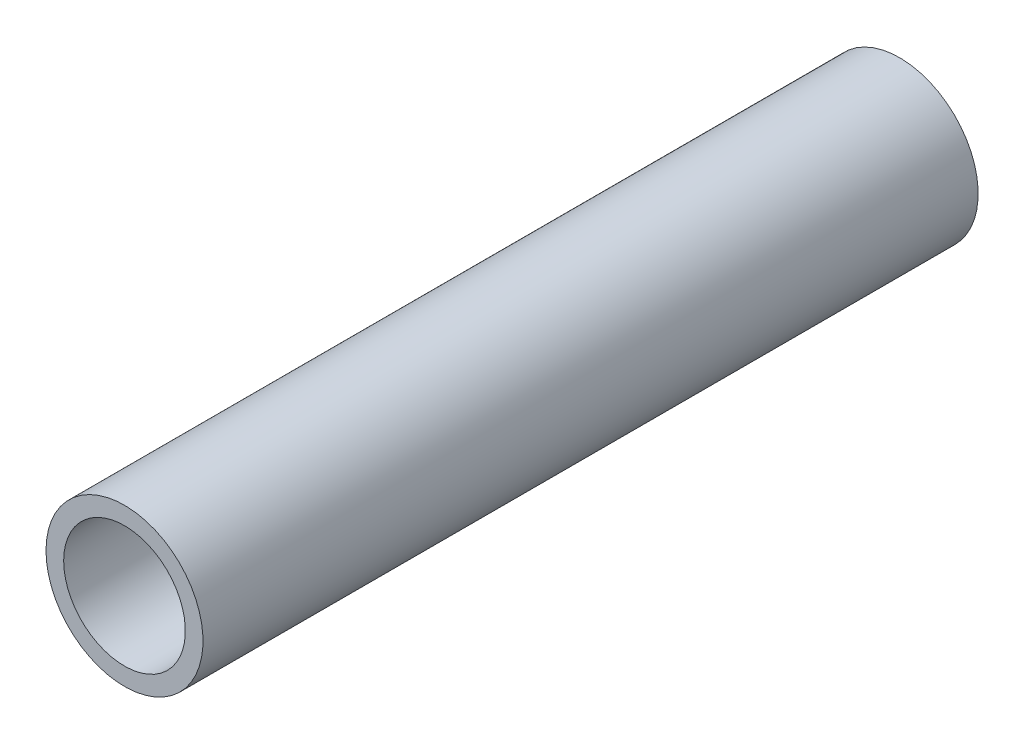
ISO-10303-21;
HEADER;
FILE_DESCRIPTION(('STEP AP214'),'2;1');
FILE_NAME('part.step','',(''),(''),'','','');
FILE_SCHEMA(('AUTOMOTIVE_DESIGN { 1 0 10303 214 1 1 1 1 }'));
ENDSEC;
DATA;
#1=APPLICATION_CONTEXT('core data for automotive mechanical design processes');
#2=APPLICATION_PROTOCOL_DEFINITION('international standard','automotive_design',2000,#1);
#3=PRODUCT_CONTEXT('',#1,'mechanical');
#4=PRODUCT('Part','Part','',(#3));
#5=PRODUCT_RELATED_PRODUCT_CATEGORY('part','',(#4));
#6=PRODUCT_DEFINITION_FORMATION('','',#4);
#7=PRODUCT_DEFINITION_CONTEXT('part definition',#1,'design');
#8=PRODUCT_DEFINITION('design','',#6,#7);
#9=PRODUCT_DEFINITION_SHAPE('','',#8);
#10=(LENGTH_UNIT() NAMED_UNIT(*) SI_UNIT(.MILLI.,.METRE.));
#11=(NAMED_UNIT(*) PLANE_ANGLE_UNIT() SI_UNIT($,.RADIAN.));
#12=(NAMED_UNIT(*) SI_UNIT($,.STERADIAN.) SOLID_ANGLE_UNIT());
#13=UNCERTAINTY_MEASURE_WITH_UNIT(LENGTH_MEASURE(1.E-05),#10,'distance_accuracy_value','');
#14=(GEOMETRIC_REPRESENTATION_CONTEXT(3) GLOBAL_UNCERTAINTY_ASSIGNED_CONTEXT((#13)) GLOBAL_UNIT_ASSIGNED_CONTEXT((#10,
#11,#12)) REPRESENTATION_CONTEXT('',''));
#15=CARTESIAN_POINT('',(0.,0.,0.));
#16=DIRECTION('',(0.,0.,1.));
#17=DIRECTION('',(1.,0.,0.));
#18=AXIS2_PLACEMENT_3D('',#15,#16,#17);
#19=CARTESIAN_POINT('',(0.,0.,39.5));
#20=DIRECTION('',(0.,0.,-1.));
#21=DIRECTION('',(-1.,0.,0.));
#22=AXIS2_PLACEMENT_3D('',#19,#20,#21);
#23=CYLINDRICAL_SURFACE('',#22,6.2);
#24=CARTESIAN_POINT('',(0.,0.,79.));
#25=DIRECTION('',(0.,0.,-1.));
#26=DIRECTION('',(-1.,0.,0.));
#27=AXIS2_PLACEMENT_3D('',#24,#25,#26);
#28=CIRCLE('',#27,6.2);
#29=CARTESIAN_POINT('',(-6.2,0.,79.));
#30=VERTEX_POINT('',#29);
#31=EDGE_CURVE('E27',#30,#30,#28,.T.);
#32=ORIENTED_EDGE('',*,*,#31,.F.);
#33=EDGE_LOOP('',(#32));
#34=FACE_BOUND('',#33,.T.);
#35=CARTESIAN_POINT('',(0.,0.,0.));
#36=DIRECTION('',(0.,0.,-1.));
#37=DIRECTION('',(-1.,0.,0.));
#38=AXIS2_PLACEMENT_3D('',#35,#36,#37);
#39=CIRCLE('',#38,6.2);
#40=CARTESIAN_POINT('',(-6.2,0.,0.));
#41=VERTEX_POINT('',#40);
#42=EDGE_CURVE('E18',#41,#41,#39,.F.);
#43=ORIENTED_EDGE('',*,*,#42,.F.);
#44=EDGE_LOOP('',(#43));
#45=FACE_BOUND('',#44,.T.);
#46=ADVANCED_FACE('F15',(#34,#45),#23,.F.);
#47=CARTESIAN_POINT('',(0.,0.,0.));
#48=DIRECTION('',(0.,0.,-1.));
#49=DIRECTION('',(-1.,0.,0.));
#50=AXIS2_PLACEMENT_3D('',#47,#48,#49);
#51=PLANE('',#50);
#52=CARTESIAN_POINT('',(0.,0.,0.));
#53=DIRECTION('',(0.,0.,-1.));
#54=DIRECTION('',(-1.,0.,0.));
#55=AXIS2_PLACEMENT_3D('',#52,#53,#54);
#56=CIRCLE('',#55,8.);
#57=CARTESIAN_POINT('',(-8.,0.,0.));
#58=VERTEX_POINT('',#57);
#59=EDGE_CURVE('E22',#58,#58,#56,.F.);
#60=ORIENTED_EDGE('',*,*,#59,.F.);
#61=EDGE_LOOP('',(#60));
#62=FACE_BOUND('',#61,.T.);
#63=ORIENTED_EDGE('',*,*,#42,.T.);
#64=EDGE_LOOP('',(#63));
#65=FACE_BOUND('',#64,.T.);
#66=ADVANCED_FACE('F35',(#62,#65),#51,.T.);
#67=CARTESIAN_POINT('',(0.,0.,79.));
#68=DIRECTION('',(0.,0.,1.));
#69=DIRECTION('',(1.,0.,0.));
#70=AXIS2_PLACEMENT_3D('',#67,#68,#69);
#71=PLANE('',#70);
#72=CARTESIAN_POINT('',(0.,0.,79.));
#73=DIRECTION('',(0.,0.,-1.));
#74=DIRECTION('',(-1.,0.,0.));
#75=AXIS2_PLACEMENT_3D('',#72,#73,#74);
#76=CIRCLE('',#75,8.);
#77=CARTESIAN_POINT('',(-8.,0.,79.));
#78=VERTEX_POINT('',#77);
#79=EDGE_CURVE('E10',#78,#78,#76,.T.);
#80=ORIENTED_EDGE('',*,*,#79,.F.);
#81=EDGE_LOOP('',(#80));
#82=FACE_BOUND('',#81,.T.);
#83=ORIENTED_EDGE('',*,*,#31,.T.);
#84=EDGE_LOOP('',(#83));
#85=FACE_BOUND('',#84,.T.);
#86=ADVANCED_FACE('F43',(#82,#85),#71,.T.);
#87=CARTESIAN_POINT('',(0.,0.,39.5));
#88=DIRECTION('',(0.,0.,-1.));
#89=DIRECTION('',(-1.,0.,0.));
#90=AXIS2_PLACEMENT_3D('',#87,#88,#89);
#91=CYLINDRICAL_SURFACE('',#90,8.);
#92=ORIENTED_EDGE('',*,*,#59,.T.);
#93=EDGE_LOOP('',(#92));
#94=FACE_BOUND('',#93,.T.);
#95=ORIENTED_EDGE('',*,*,#79,.T.);
#96=EDGE_LOOP('',(#95));
#97=FACE_BOUND('',#96,.T.);
#98=ADVANCED_FACE('F45',(#94,#97),#91,.T.);
#99=CLOSED_SHELL('',(#46,#66,#86,#98));
#100=MANIFOLD_SOLID_BREP('B1',#99);
#101=ADVANCED_BREP_SHAPE_REPRESENTATION('',(#18,#100),#14);
#102=SHAPE_DEFINITION_REPRESENTATION(#9,#101);
ENDSEC;
END-ISO-10303-21;
